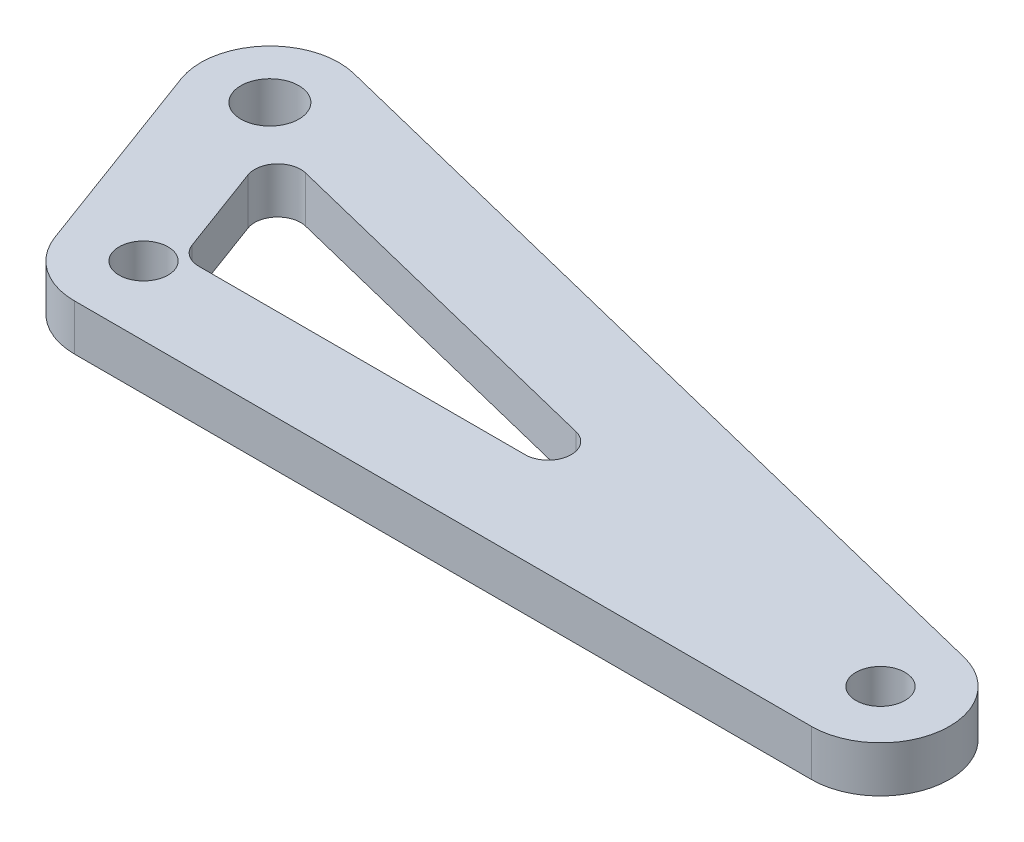
ISO-10303-21;
HEADER;
FILE_DESCRIPTION(('STEP AP214'),'2;1');
FILE_NAME('part.step','',(''),(''),'','','');
FILE_SCHEMA(('AUTOMOTIVE_DESIGN { 1 0 10303 214 1 1 1 1 }'));
ENDSEC;
DATA;
#1=APPLICATION_CONTEXT('core data for automotive mechanical design processes');
#2=APPLICATION_PROTOCOL_DEFINITION('international standard','automotive_design',2000,#1);
#3=PRODUCT_CONTEXT('',#1,'mechanical');
#4=PRODUCT('Part','Part','',(#3));
#5=PRODUCT_RELATED_PRODUCT_CATEGORY('part','',(#4));
#6=PRODUCT_DEFINITION_FORMATION('','',#4);
#7=PRODUCT_DEFINITION_CONTEXT('part definition',#1,'design');
#8=PRODUCT_DEFINITION('design','',#6,#7);
#9=PRODUCT_DEFINITION_SHAPE('','',#8);
#10=(LENGTH_UNIT() NAMED_UNIT(*) SI_UNIT(.MILLI.,.METRE.));
#11=(NAMED_UNIT(*) PLANE_ANGLE_UNIT() SI_UNIT($,.RADIAN.));
#12=(NAMED_UNIT(*) SI_UNIT($,.STERADIAN.) SOLID_ANGLE_UNIT());
#13=UNCERTAINTY_MEASURE_WITH_UNIT(LENGTH_MEASURE(1.E-05),#10,'distance_accuracy_value','');
#14=(GEOMETRIC_REPRESENTATION_CONTEXT(3) GLOBAL_UNCERTAINTY_ASSIGNED_CONTEXT((#13)) GLOBAL_UNIT_ASSIGNED_CONTEXT((#10,
#11,#12)) REPRESENTATION_CONTEXT('',''));
#15=CARTESIAN_POINT('',(0.,0.,0.));
#16=DIRECTION('',(0.,0.,1.));
#17=DIRECTION('',(1.,0.,0.));
#18=AXIS2_PLACEMENT_3D('',#15,#16,#17);
#19=CARTESIAN_POINT('',(4.42099854778567,6.35,-6.35));
#20=DIRECTION('',(0.,-1.,0.));
#21=DIRECTION('',(0.,0.,-1.));
#22=AXIS2_PLACEMENT_3D('',#19,#20,#21);
#23=CYLINDRICAL_SURFACE('',#22,3.175);
#24=CARTESIAN_POINT('',(4.42099854778567,0.,-6.35));
#25=DIRECTION('',(0.,1.,0.));
#26=DIRECTION('',(0.,0.,1.));
#27=AXIS2_PLACEMENT_3D('',#24,#25,#26);
#28=CIRCLE('',#27,3.175);
#29=CARTESIAN_POINT('',(4.42099854778567,0.,-3.175));
#30=VERTEX_POINT('',#29);
#31=CARTESIAN_POINT('',(1.44333897353087,0.,-5.24810687457962));
#32=VERTEX_POINT('',#31);
#33=EDGE_CURVE('E208',#30,#32,#28,.F.);
#34=ORIENTED_EDGE('',*,*,#33,.T.);
#35=DIRECTION('',(0.,-1.,0.));
#36=VECTOR('',#35,1.);
#37=CARTESIAN_POINT('',(1.44333897353087,6.35,-5.24810687457962));
#38=LINE('',#37,#36);
#39=CARTESIAN_POINT('',(1.44333897353087,6.35,-5.24810687457962));
#40=VERTEX_POINT('',#39);
#41=EDGE_CURVE('E11',#40,#32,#38,.T.);
#42=ORIENTED_EDGE('',*,*,#41,.F.);
#43=CARTESIAN_POINT('',(4.42099854778567,6.35,-6.35));
#44=DIRECTION('',(0.,1.,0.));
#45=DIRECTION('',(0.,0.,1.));
#46=AXIS2_PLACEMENT_3D('',#43,#44,#45);
#47=CIRCLE('',#46,3.175);
#48=CARTESIAN_POINT('',(4.42099854778567,6.35,-3.175));
#49=VERTEX_POINT('',#48);
#50=EDGE_CURVE('E303',#49,#40,#47,.F.);
#51=ORIENTED_EDGE('',*,*,#50,.F.);
#52=DIRECTION('',(0.,-1.,0.));
#53=VECTOR('',#52,1.);
#54=CARTESIAN_POINT('',(4.42099854778567,6.35,-3.175));
#55=LINE('',#54,#53);
#56=EDGE_CURVE('E239',#49,#30,#55,.T.);
#57=ORIENTED_EDGE('',*,*,#56,.T.);
#58=EDGE_LOOP('',(#34,#42,#51,#57));
#59=FACE_BOUND('',#58,.T.);
#60=ADVANCED_FACE('F47',(#59),#23,.F.);
#61=CARTESIAN_POINT('',(2.97765957425481,6.35,-1.10189312542038));
#62=DIRECTION('',(-0.937845535198364,0.,0.347052952888308));
#63=DIRECTION('',(0.347052952888308,0.,0.937845535198364));
#64=AXIS2_PLACEMENT_3D('',#61,#62,#63);
#65=PLANE('',#64);
#66=DIRECTION('',(-0.347052952888308,0.,-0.937845535198364));
#67=VECTOR('',#66,1.);
#68=CARTESIAN_POINT('',(2.97765957425481,0.,-1.10189312542038));
#69=LINE('',#68,#67);
#70=CARTESIAN_POINT('',(-3.08722169239108,0.,-17.4910976260448));
#71=VERTEX_POINT('',#70);
#72=EDGE_CURVE('E212',#32,#71,#69,.T.);
#73=ORIENTED_EDGE('',*,*,#72,.T.);
#74=DIRECTION('',(0.,-1.,0.));
#75=VECTOR('',#74,1.);
#76=CARTESIAN_POINT('',(-3.08722169239108,6.35,-17.4910976260448));
#77=LINE('',#76,#75);
#78=CARTESIAN_POINT('',(-3.08722169239108,6.35,-17.4910976260448));
#79=VERTEX_POINT('',#78);
#80=EDGE_CURVE('E58',#79,#71,#77,.T.);
#81=ORIENTED_EDGE('',*,*,#80,.F.);
#82=DIRECTION('',(-0.347052952888308,0.,-0.937845535198364));
#83=VECTOR('',#82,1.);
#84=CARTESIAN_POINT('',(2.97765957425481,6.35,-1.10189312542038));
#85=LINE('',#84,#83);
#86=EDGE_CURVE('E306',#40,#79,#85,.T.);
#87=ORIENTED_EDGE('',*,*,#86,.F.);
#88=ORIENTED_EDGE('',*,*,#41,.T.);
#89=EDGE_LOOP('',(#73,#81,#87,#88));
#90=FACE_BOUND('',#89,.T.);
#91=ADVANCED_FACE('F335',(#90),#65,.F.);
#92=CARTESIAN_POINT('',(-0.109562118136276,6.35,-18.5929907514651));
#93=DIRECTION('',(0.,-1.,0.));
#94=DIRECTION('',(0.,0.,-1.));
#95=AXIS2_PLACEMENT_3D('',#92,#93,#94);
#96=CYLINDRICAL_SURFACE('',#95,3.175);
#97=CARTESIAN_POINT('',(-0.109562118136276,0.,-18.5929907514651));
#98=DIRECTION('',(0.,1.,0.));
#99=DIRECTION('',(0.,0.,1.));
#100=AXIS2_PLACEMENT_3D('',#97,#98,#99);
#101=CIRCLE('',#100,3.175);
#102=CARTESIAN_POINT('',(0.652372476586138,0.,-21.6752108398698));
#103=VERTEX_POINT('',#102);
#104=EDGE_CURVE('E216',#103,#71,#101,.T.);
#105=ORIENTED_EDGE('',*,*,#104,.F.);
#106=DIRECTION('',(0.,-1.,0.));
#107=VECTOR('',#106,1.);
#108=CARTESIAN_POINT('',(0.652372476586138,6.35,-21.6752108398698));
#109=LINE('',#108,#107);
#110=CARTESIAN_POINT('',(0.652372476586138,6.35,-21.6752108398698));
#111=VERTEX_POINT('',#110);
#112=EDGE_CURVE('E166',#111,#103,#109,.T.);
#113=ORIENTED_EDGE('',*,*,#112,.F.);
#114=CARTESIAN_POINT('',(-0.109562118136276,6.35,-18.5929907514651));
#115=DIRECTION('',(0.,1.,0.));
#116=DIRECTION('',(0.,0.,1.));
#117=AXIS2_PLACEMENT_3D('',#114,#115,#116);
#118=CIRCLE('',#117,3.175);
#119=EDGE_CURVE('E157',#111,#79,#118,.T.);
#120=ORIENTED_EDGE('',*,*,#119,.T.);
#121=ORIENTED_EDGE('',*,*,#80,.T.);
#122=EDGE_LOOP('',(#105,#113,#120,#121));
#123=FACE_BOUND('',#122,.T.);
#124=ADVANCED_FACE('F311',(#123),#96,.F.);
#125=CARTESIAN_POINT('',(5.08717291893286,6.35,-20.5789140859728));
#126=DIRECTION('',(0.239979399912571,0.,-0.970777980599891));
#127=DIRECTION('',(-0.970777980599891,0.,-0.239979399912571));
#128=AXIS2_PLACEMENT_3D('',#125,#126,#127);
#129=PLANE('',#128);
#130=DIRECTION('',(0.970777980599891,0.,0.239979399912571));
#131=VECTOR('',#130,1.);
#132=CARTESIAN_POINT('',(5.08717291893286,0.,-20.5789140859728));
#133=LINE('',#132,#131);
#134=CARTESIAN_POINT('',(50.1783978043456,0.,-9.43222008840465));
#135=VERTEX_POINT('',#134);
#136=EDGE_CURVE('E164',#103,#135,#133,.T.);
#137=ORIENTED_EDGE('',*,*,#136,.T.);
#138=DIRECTION('',(0.,-1.,0.));
#139=VECTOR('',#138,1.);
#140=CARTESIAN_POINT('',(50.1783978043456,6.35,-9.43222008840465));
#141=LINE('',#140,#139);
#142=CARTESIAN_POINT('',(50.1783978043456,6.35,-9.43222008840465));
#143=VERTEX_POINT('',#142);
#144=EDGE_CURVE('E161',#143,#135,#141,.T.);
#145=ORIENTED_EDGE('',*,*,#144,.F.);
#146=DIRECTION('',(0.970777980599891,0.,0.239979399912571));
#147=VECTOR('',#146,1.);
#148=CARTESIAN_POINT('',(5.08717291893286,6.35,-20.5789140859728));
#149=LINE('',#148,#147);
#150=EDGE_CURVE('E150',#111,#143,#149,.T.);
#151=ORIENTED_EDGE('',*,*,#150,.F.);
#152=ORIENTED_EDGE('',*,*,#112,.T.);
#153=EDGE_LOOP('',(#137,#145,#151,#152));
#154=FACE_BOUND('',#153,.T.);
#155=ADVANCED_FACE('F162',(#154),#129,.F.);
#156=CARTESIAN_POINT('',(49.4164632096231,6.35,-6.35));
#157=DIRECTION('',(0.,-1.,0.));
#158=DIRECTION('',(0.,0.,-1.));
#159=AXIS2_PLACEMENT_3D('',#156,#157,#158);
#160=CYLINDRICAL_SURFACE('',#159,3.175);
#161=CARTESIAN_POINT('',(49.4164632096231,0.,-6.35));
#162=DIRECTION('',(0.,1.,0.));
#163=DIRECTION('',(0.,0.,1.));
#164=AXIS2_PLACEMENT_3D('',#161,#162,#163);
#165=CIRCLE('',#164,3.175);
#166=CARTESIAN_POINT('',(49.4164632096231,0.,-3.175));
#167=VERTEX_POINT('',#166);
#168=EDGE_CURVE('E108',#135,#167,#165,.F.);
#169=ORIENTED_EDGE('',*,*,#168,.T.);
#170=DIRECTION('',(0.,-1.,0.));
#171=VECTOR('',#170,1.);
#172=CARTESIAN_POINT('',(49.4164632096231,6.35,-3.175));
#173=LINE('',#172,#171);
#174=CARTESIAN_POINT('',(49.4164632096231,6.35,-3.175));
#175=VERTEX_POINT('',#174);
#176=EDGE_CURVE('E167',#175,#167,#173,.T.);
#177=ORIENTED_EDGE('',*,*,#176,.F.);
#178=CARTESIAN_POINT('',(49.4164632096231,6.35,-6.35));
#179=DIRECTION('',(0.,1.,0.));
#180=DIRECTION('',(0.,0.,1.));
#181=AXIS2_PLACEMENT_3D('',#178,#179,#180);
#182=CIRCLE('',#181,3.175);
#183=EDGE_CURVE('E155',#143,#175,#182,.F.);
#184=ORIENTED_EDGE('',*,*,#183,.F.);
#185=ORIENTED_EDGE('',*,*,#144,.T.);
#186=EDGE_LOOP('',(#169,#177,#184,#185));
#187=FACE_BOUND('',#186,.T.);
#188=ADVANCED_FACE('F169',(#187),#160,.F.);
#189=CARTESIAN_POINT('',(-8.93297872276442,6.35,3.30567937626113));
#190=DIRECTION('',(0.937845535198364,0.,-0.347052952888308));
#191=DIRECTION('',(-0.347052952888308,0.,-0.937845535198364));
#192=AXIS2_PLACEMENT_3D('',#189,#190,#191);
#193=PLANE('',#192);
#194=DIRECTION('',(0.347052952888308,0.,0.937845535198364));
#195=VECTOR('',#194,1.);
#196=CARTESIAN_POINT('',(-8.93297872276442,0.,3.30567937626113));
#197=LINE('',#196,#195);
#198=CARTESIAN_POINT('',(-19.1594284411659,0.,-24.3293836004829));
#199=VERTEX_POINT('',#198);
#200=CARTESIAN_POINT('',(-8.93297872276442,0.,3.30567937626113));
#201=VERTEX_POINT('',#200);
#202=EDGE_CURVE('E189',#199,#201,#197,.T.);
#203=ORIENTED_EDGE('',*,*,#202,.T.);
#204=DIRECTION('',(0.,-1.,0.));
#205=VECTOR('',#204,1.);
#206=CARTESIAN_POINT('',(-8.93297872276442,6.35,3.30567937626113));
#207=LINE('',#206,#205);
#208=CARTESIAN_POINT('',(-8.93297872276442,6.35,3.30567937626113));
#209=VERTEX_POINT('',#208);
#210=EDGE_CURVE('E51',#209,#201,#207,.T.);
#211=ORIENTED_EDGE('',*,*,#210,.F.);
#212=DIRECTION('',(0.347052952888308,0.,0.937845535198364));
#213=VECTOR('',#212,1.);
#214=CARTESIAN_POINT('',(-8.93297872276442,6.35,3.30567937626113));
#215=LINE('',#214,#213);
#216=CARTESIAN_POINT('',(-19.1594284411659,6.35,-24.3293836004829));
#217=VERTEX_POINT('',#216);
#218=EDGE_CURVE('E238',#217,#209,#215,.T.);
#219=ORIENTED_EDGE('',*,*,#218,.F.);
#220=DIRECTION('',(0.,-1.,0.));
#221=VECTOR('',#220,1.);
#222=CARTESIAN_POINT('',(-19.1594284411659,6.35,-24.3293836004829));
#223=LINE('',#222,#221);
#224=EDGE_CURVE('E188',#217,#199,#223,.T.);
#225=ORIENTED_EDGE('',*,*,#224,.T.);
#226=EDGE_LOOP('',(#203,#211,#219,#225));
#227=FACE_BOUND('',#226,.T.);
#228=ADVANCED_FACE('F49',(#227),#193,.F.);
#229=CARTESIAN_POINT('',(0.,6.35,0.));
#230=DIRECTION('',(0.,-1.,0.));
#231=DIRECTION('',(0.,0.,-1.));
#232=AXIS2_PLACEMENT_3D('',#229,#230,#231);
#233=CYLINDRICAL_SURFACE('',#232,9.525);
#234=CARTESIAN_POINT('',(0.,0.,0.));
#235=DIRECTION('',(0.,1.,0.));
#236=DIRECTION('',(0.,0.,1.));
#237=AXIS2_PLACEMENT_3D('',#234,#235,#236);
#238=CIRCLE('',#237,9.525);
#239=CARTESIAN_POINT('',(0.,0.,9.525));
#240=VERTEX_POINT('',#239);
#241=EDGE_CURVE('E193',#201,#240,#238,.T.);
#242=ORIENTED_EDGE('',*,*,#241,.T.);
#243=DIRECTION('',(0.,-1.,0.));
#244=VECTOR('',#243,1.);
#245=CARTESIAN_POINT('',(0.,6.35,9.525));
#246=LINE('',#245,#244);
#247=CARTESIAN_POINT('',(0.,6.35,9.525));
#248=VERTEX_POINT('',#247);
#249=EDGE_CURVE('E262',#248,#240,#246,.T.);
#250=ORIENTED_EDGE('',*,*,#249,.F.);
#251=CARTESIAN_POINT('',(0.,6.35,0.));
#252=DIRECTION('',(0.,1.,0.));
#253=DIRECTION('',(0.,0.,1.));
#254=AXIS2_PLACEMENT_3D('',#251,#252,#253);
#255=CIRCLE('',#254,9.525);
#256=EDGE_CURVE('E123',#209,#248,#255,.T.);
#257=ORIENTED_EDGE('',*,*,#256,.F.);
#258=ORIENTED_EDGE('',*,*,#210,.T.);
#259=EDGE_LOOP('',(#242,#250,#257,#258));
#260=FACE_BOUND('',#259,.T.);
#261=ADVANCED_FACE('F270',(#260),#233,.T.);
#262=CARTESIAN_POINT('',(0.,6.35,9.525));
#263=DIRECTION('',(0.,0.,-1.));
#264=DIRECTION('',(-1.,0.,0.));
#265=AXIS2_PLACEMENT_3D('',#262,#263,#264);
#266=PLANE('',#265);
#267=DIRECTION('',(1.,0.,0.));
#268=VECTOR('',#267,1.);
#269=CARTESIAN_POINT('',(0.,0.,9.525));
#270=LINE('',#269,#268);
#271=CARTESIAN_POINT('',(101.56444,0.,9.525));
#272=VERTEX_POINT('',#271);
#273=EDGE_CURVE('E196',#240,#272,#270,.T.);
#274=ORIENTED_EDGE('',*,*,#273,.T.);
#275=DIRECTION('',(0.,-1.,0.));
#276=VECTOR('',#275,1.);
#277=CARTESIAN_POINT('',(101.56444,6.35,9.525));
#278=LINE('',#277,#276);
#279=CARTESIAN_POINT('',(101.56444,6.35,9.525));
#280=VERTEX_POINT('',#279);
#281=EDGE_CURVE('E259',#280,#272,#278,.T.);
#282=ORIENTED_EDGE('',*,*,#281,.F.);
#283=DIRECTION('',(1.,0.,0.));
#284=VECTOR('',#283,1.);
#285=CARTESIAN_POINT('',(0.,6.35,9.525));
#286=LINE('',#285,#284);
#287=EDGE_CURVE('E292',#248,#280,#286,.T.);
#288=ORIENTED_EDGE('',*,*,#287,.F.);
#289=ORIENTED_EDGE('',*,*,#249,.T.);
#290=EDGE_LOOP('',(#274,#282,#288,#289));
#291=FACE_BOUND('',#290,.T.);
#292=ADVANCED_FACE('F282',(#291),#266,.F.);
#293=CARTESIAN_POINT('',(101.56444,6.35,0.));
#294=DIRECTION('',(0.,-1.,0.));
#295=DIRECTION('',(0.,0.,-1.));
#296=AXIS2_PLACEMENT_3D('',#293,#294,#295);
#297=CYLINDRICAL_SURFACE('',#296,9.52500000000001);
#298=CARTESIAN_POINT('',(101.56444,0.,0.));
#299=DIRECTION('',(0.,1.,0.));
#300=DIRECTION('',(0.,0.,1.));
#301=AXIS2_PLACEMENT_3D('',#298,#299,#300);
#302=CIRCLE('',#301,9.52500000000001);
#303=CARTESIAN_POINT('',(103.850243784167,0.,-9.24666026521397));
#304=VERTEX_POINT('',#303);
#305=EDGE_CURVE('E199',#272,#304,#302,.T.);
#306=ORIENTED_EDGE('',*,*,#305,.T.);
#307=DIRECTION('',(0.,-1.,0.));
#308=VECTOR('',#307,1.);
#309=CARTESIAN_POINT('',(103.850243784167,6.35,-9.24666026521397));
#310=LINE('',#309,#308);
#311=CARTESIAN_POINT('',(103.850243784167,6.35,-9.24666026521397));
#312=VERTEX_POINT('',#311);
#313=EDGE_CURVE('E255',#312,#304,#310,.T.);
#314=ORIENTED_EDGE('',*,*,#313,.F.);
#315=CARTESIAN_POINT('',(101.56444,6.35,0.));
#316=DIRECTION('',(0.,1.,0.));
#317=DIRECTION('',(0.,0.,1.));
#318=AXIS2_PLACEMENT_3D('',#315,#316,#317);
#319=CIRCLE('',#318,9.52500000000001);
#320=EDGE_CURVE('E287',#280,#312,#319,.T.);
#321=ORIENTED_EDGE('',*,*,#320,.F.);
#322=ORIENTED_EDGE('',*,*,#281,.T.);
#323=EDGE_LOOP('',(#306,#314,#321,#322));
#324=FACE_BOUND('',#323,.T.);
#325=ADVANCED_FACE('F285',(#324),#297,.T.);
#326=CARTESIAN_POINT('',(8.1349112978225,6.35,-32.9077944395914));
#327=DIRECTION('',(-0.239979399912571,0.,0.970777980599891));
#328=DIRECTION('',(0.970777980599891,0.,0.239979399912571));
#329=AXIS2_PLACEMENT_3D('',#326,#327,#328);
#330=PLANE('',#329);
#331=DIRECTION('',(-0.970777980599891,0.,-0.239979399912571));
#332=VECTOR('',#331,1.);
#333=CARTESIAN_POINT('',(8.1349112978225,0.,-32.9077944395914));
#334=LINE('',#333,#332);
#335=CARTESIAN_POINT('',(-7.94064593423421,0.,-36.881723241958));
#336=VERTEX_POINT('',#335);
#337=EDGE_CURVE('E202',#304,#336,#334,.T.);
#338=ORIENTED_EDGE('',*,*,#337,.T.);
#339=DIRECTION('',(0.,-1.,0.));
#340=VECTOR('',#339,1.);
#341=CARTESIAN_POINT('',(-7.94064593423421,6.35,-36.881723241958));
#342=LINE('',#341,#340);
#343=CARTESIAN_POINT('',(-7.94064593423421,6.35,-36.881723241958));
#344=VERTEX_POINT('',#343);
#345=EDGE_CURVE('E251',#344,#336,#342,.T.);
#346=ORIENTED_EDGE('',*,*,#345,.F.);
#347=DIRECTION('',(-0.970777980599891,0.,-0.239979399912571));
#348=VECTOR('',#347,1.);
#349=CARTESIAN_POINT('',(8.1349112978225,6.35,-32.9077944395914));
#350=LINE('',#349,#348);
#351=EDGE_CURVE('E291',#312,#344,#350,.T.);
#352=ORIENTED_EDGE('',*,*,#351,.F.);
#353=ORIENTED_EDGE('',*,*,#313,.T.);
#354=EDGE_LOOP('',(#338,#346,#352,#353));
#355=FACE_BOUND('',#354,.T.);
#356=ADVANCED_FACE('F344',(#355),#330,.F.);
#357=CARTESIAN_POINT('',(0.,6.35,0.));
#358=DIRECTION('',(0.,-1.,0.));
#359=DIRECTION('',(0.,0.,-1.));
#360=AXIS2_PLACEMENT_3D('',#357,#358,#359);
#361=CYLINDRICAL_SURFACE('',#360,3.3782);
#362=CARTESIAN_POINT('',(0.,6.35,0.));
#363=DIRECTION('',(0.,1.,0.));
#364=DIRECTION('',(0.,0.,1.));
#365=AXIS2_PLACEMENT_3D('',#362,#363,#364);
#366=CIRCLE('',#365,3.3782);
#367=CARTESIAN_POINT('',(0.,6.35,3.3782));
#368=VERTEX_POINT('',#367);
#369=EDGE_CURVE('E180',#368,#368,#366,.T.);
#370=ORIENTED_EDGE('',*,*,#369,.T.);
#371=EDGE_LOOP('',(#370));
#372=FACE_BOUND('',#371,.T.);
#373=CARTESIAN_POINT('',(0.,0.,0.));
#374=DIRECTION('',(0.,1.,0.));
#375=DIRECTION('',(0.,0.,1.));
#376=AXIS2_PLACEMENT_3D('',#373,#374,#375);
#377=CIRCLE('',#376,3.3782);
#378=CARTESIAN_POINT('',(0.,0.,3.3782));
#379=VERTEX_POINT('',#378);
#380=EDGE_CURVE('E230',#379,#379,#377,.T.);
#381=ORIENTED_EDGE('',*,*,#380,.F.);
#382=EDGE_LOOP('',(#381));
#383=FACE_BOUND('',#382,.T.);
#384=ADVANCED_FACE('F330',(#372,#383),#361,.F.);
#385=CARTESIAN_POINT('',(101.56444,6.35,0.));
#386=DIRECTION('',(0.,-1.,0.));
#387=DIRECTION('',(0.,0.,-1.));
#388=AXIS2_PLACEMENT_3D('',#385,#386,#387);
#389=CYLINDRICAL_SURFACE('',#388,3.37819999999999);
#390=CARTESIAN_POINT('',(101.56444,6.35,0.));
#391=DIRECTION('',(0.,1.,0.));
#392=DIRECTION('',(0.,0.,1.));
#393=AXIS2_PLACEMENT_3D('',#390,#391,#392);
#394=CIRCLE('',#393,3.37819999999999);
#395=CARTESIAN_POINT('',(101.56444,6.35,3.37819999999999));
#396=VERTEX_POINT('',#395);
#397=EDGE_CURVE('E173',#396,#396,#394,.T.);
#398=ORIENTED_EDGE('',*,*,#397,.T.);
#399=EDGE_LOOP('',(#398));
#400=FACE_BOUND('',#399,.T.);
#401=CARTESIAN_POINT('',(101.56444,0.,0.));
#402=DIRECTION('',(0.,1.,0.));
#403=DIRECTION('',(0.,0.,1.));
#404=AXIS2_PLACEMENT_3D('',#401,#402,#403);
#405=CIRCLE('',#404,3.37819999999999);
#406=CARTESIAN_POINT('',(101.56444,0.,3.37819999999999));
#407=VERTEX_POINT('',#406);
#408=EDGE_CURVE('E226',#407,#407,#405,.T.);
#409=ORIENTED_EDGE('',*,*,#408,.F.);
#410=EDGE_LOOP('',(#409));
#411=FACE_BOUND('',#410,.T.);
#412=ADVANCED_FACE('F321',(#400,#411),#389,.F.);
#413=CARTESIAN_POINT('',(0.,6.35,-3.175));
#414=DIRECTION('',(0.,0.,1.));
#415=DIRECTION('',(1.,0.,0.));
#416=AXIS2_PLACEMENT_3D('',#413,#414,#415);
#417=PLANE('',#416);
#418=DIRECTION('',(-1.,0.,0.));
#419=VECTOR('',#418,1.);
#420=CARTESIAN_POINT('',(0.,0.,-3.175));
#421=LINE('',#420,#419);
#422=EDGE_CURVE('E114',#167,#30,#421,.T.);
#423=ORIENTED_EDGE('',*,*,#422,.T.);
#424=ORIENTED_EDGE('',*,*,#56,.F.);
#425=DIRECTION('',(-1.,0.,0.));
#426=VECTOR('',#425,1.);
#427=CARTESIAN_POINT('',(0.,6.35,-3.175));
#428=LINE('',#427,#426);
#429=EDGE_CURVE('E67',#175,#49,#428,.T.);
#430=ORIENTED_EDGE('',*,*,#429,.F.);
#431=ORIENTED_EDGE('',*,*,#176,.T.);
#432=EDGE_LOOP('',(#423,#424,#430,#431));
#433=FACE_BOUND('',#432,.T.);
#434=ADVANCED_FACE('F318',(#433),#417,.F.);
#435=CARTESIAN_POINT('',(-10.2264497184014,6.35,-27.635062976744));
#436=DIRECTION('',(0.,-1.,0.));
#437=DIRECTION('',(0.,0.,-1.));
#438=AXIS2_PLACEMENT_3D('',#435,#436,#437);
#439=CYLINDRICAL_SURFACE('',#438,9.52500000000002);
#440=CARTESIAN_POINT('',(-10.2264497184014,0.,-27.635062976744));
#441=DIRECTION('',(0.,1.,0.));
#442=DIRECTION('',(0.,0.,1.));
#443=AXIS2_PLACEMENT_3D('',#440,#441,#442);
#444=CIRCLE('',#443,9.52500000000002);
#445=EDGE_CURVE('E205',#336,#199,#444,.T.);
#446=ORIENTED_EDGE('',*,*,#445,.T.);
#447=ORIENTED_EDGE('',*,*,#224,.F.);
#448=CARTESIAN_POINT('',(-10.2264497184014,6.35,-27.635062976744));
#449=DIRECTION('',(0.,1.,0.));
#450=DIRECTION('',(0.,0.,1.));
#451=AXIS2_PLACEMENT_3D('',#448,#449,#450);
#452=CIRCLE('',#451,9.52500000000002);
#453=EDGE_CURVE('E296',#344,#217,#452,.T.);
#454=ORIENTED_EDGE('',*,*,#453,.F.);
#455=ORIENTED_EDGE('',*,*,#345,.T.);
#456=EDGE_LOOP('',(#446,#447,#454,#455));
#457=FACE_BOUND('',#456,.T.);
#458=ADVANCED_FACE('F320',(#457),#439,.T.);
#459=CARTESIAN_POINT('',(-10.2264497184014,6.35,-27.635062976744));
#460=DIRECTION('',(0.,-1.,0.));
#461=DIRECTION('',(0.,0.,-1.));
#462=AXIS2_PLACEMENT_3D('',#459,#460,#461);
#463=CYLINDRICAL_SURFACE('',#462,4.);
#464=CARTESIAN_POINT('',(-10.2264497184014,6.35,-27.635062976744));
#465=DIRECTION('',(0.,1.,0.));
#466=DIRECTION('',(0.,0.,1.));
#467=AXIS2_PLACEMENT_3D('',#464,#465,#466);
#468=CIRCLE('',#467,4.);
#469=CARTESIAN_POINT('',(-10.2264497184014,6.35,-23.635062976744));
#470=VERTEX_POINT('',#469);
#471=EDGE_CURVE('E184',#470,#470,#468,.T.);
#472=ORIENTED_EDGE('',*,*,#471,.T.);
#473=EDGE_LOOP('',(#472));
#474=FACE_BOUND('',#473,.T.);
#475=CARTESIAN_POINT('',(-10.2264497184014,0.,-27.635062976744));
#476=DIRECTION('',(0.,1.,0.));
#477=DIRECTION('',(0.,0.,1.));
#478=AXIS2_PLACEMENT_3D('',#475,#476,#477);
#479=CIRCLE('',#478,4.);
#480=CARTESIAN_POINT('',(-10.2264497184014,0.,-23.635062976744));
#481=VERTEX_POINT('',#480);
#482=EDGE_CURVE('E234',#481,#481,#479,.T.);
#483=ORIENTED_EDGE('',*,*,#482,.F.);
#484=EDGE_LOOP('',(#483));
#485=FACE_BOUND('',#484,.T.);
#486=ADVANCED_FACE('F327',(#474,#485),#463,.F.);
#487=CARTESIAN_POINT('',(0.,6.35,0.));
#488=DIRECTION('',(0.,1.,0.));
#489=DIRECTION('',(0.,0.,1.));
#490=AXIS2_PLACEMENT_3D('',#487,#488,#489);
#491=PLANE('',#490);
#492=ORIENTED_EDGE('',*,*,#218,.T.);
#493=ORIENTED_EDGE('',*,*,#256,.T.);
#494=ORIENTED_EDGE('',*,*,#287,.T.);
#495=ORIENTED_EDGE('',*,*,#320,.T.);
#496=ORIENTED_EDGE('',*,*,#351,.T.);
#497=ORIENTED_EDGE('',*,*,#453,.T.);
#498=EDGE_LOOP('',(#492,#493,#494,#495,#496,#497));
#499=FACE_BOUND('',#498,.T.);
#500=ORIENTED_EDGE('',*,*,#50,.T.);
#501=ORIENTED_EDGE('',*,*,#86,.T.);
#502=ORIENTED_EDGE('',*,*,#119,.F.);
#503=ORIENTED_EDGE('',*,*,#150,.T.);
#504=ORIENTED_EDGE('',*,*,#183,.T.);
#505=ORIENTED_EDGE('',*,*,#429,.T.);
#506=EDGE_LOOP('',(#500,#501,#502,#503,#504,#505));
#507=FACE_BOUND('',#506,.T.);
#508=ORIENTED_EDGE('',*,*,#397,.F.);
#509=EDGE_LOOP('',(#508));
#510=FACE_BOUND('',#509,.T.);
#511=ORIENTED_EDGE('',*,*,#369,.F.);
#512=EDGE_LOOP('',(#511));
#513=FACE_BOUND('',#512,.T.);
#514=ORIENTED_EDGE('',*,*,#471,.F.);
#515=EDGE_LOOP('',(#514));
#516=FACE_BOUND('',#515,.T.);
#517=ADVANCED_FACE('F152',(#499,#507,#510,#513,#516),#491,.T.);
#518=CARTESIAN_POINT('',(0.,0.,0.));
#519=DIRECTION('',(0.,1.,0.));
#520=DIRECTION('',(0.,0.,1.));
#521=AXIS2_PLACEMENT_3D('',#518,#519,#520);
#522=PLANE('',#521);
#523=ORIENTED_EDGE('',*,*,#202,.F.);
#524=ORIENTED_EDGE('',*,*,#445,.F.);
#525=ORIENTED_EDGE('',*,*,#337,.F.);
#526=ORIENTED_EDGE('',*,*,#305,.F.);
#527=ORIENTED_EDGE('',*,*,#273,.F.);
#528=ORIENTED_EDGE('',*,*,#241,.F.);
#529=EDGE_LOOP('',(#523,#524,#525,#526,#527,#528));
#530=FACE_BOUND('',#529,.T.);
#531=ORIENTED_EDGE('',*,*,#33,.F.);
#532=ORIENTED_EDGE('',*,*,#422,.F.);
#533=ORIENTED_EDGE('',*,*,#168,.F.);
#534=ORIENTED_EDGE('',*,*,#136,.F.);
#535=ORIENTED_EDGE('',*,*,#104,.T.);
#536=ORIENTED_EDGE('',*,*,#72,.F.);
#537=EDGE_LOOP('',(#531,#532,#533,#534,#535,#536));
#538=FACE_BOUND('',#537,.T.);
#539=ORIENTED_EDGE('',*,*,#408,.T.);
#540=EDGE_LOOP('',(#539));
#541=FACE_BOUND('',#540,.T.);
#542=ORIENTED_EDGE('',*,*,#380,.T.);
#543=EDGE_LOOP('',(#542));
#544=FACE_BOUND('',#543,.T.);
#545=ORIENTED_EDGE('',*,*,#482,.T.);
#546=EDGE_LOOP('',(#545));
#547=FACE_BOUND('',#546,.T.);
#548=ADVANCED_FACE('F277',(#530,#538,#541,#544,#547),#522,.F.);
#549=CLOSED_SHELL('',(#60,#91,#124,#155,#188,#228,#261,#292,#325,#356,#384,#412,#434,#458,#486,
#517,#548));
#550=MANIFOLD_SOLID_BREP('B2',#549);
#551=ADVANCED_BREP_SHAPE_REPRESENTATION('',(#18,#550),#14);
#552=SHAPE_DEFINITION_REPRESENTATION(#9,#551);
ENDSEC;
END-ISO-10303-21;
